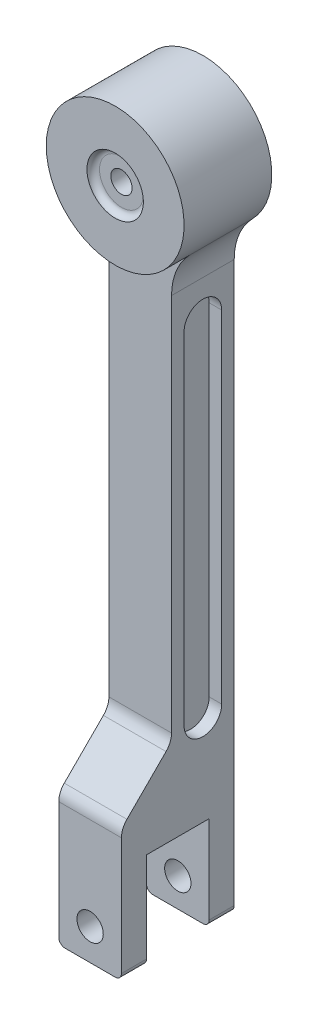
ISO-10303-21;
HEADER;
FILE_DESCRIPTION(('STEP AP214'),'2;1');
FILE_NAME('part.step','',(''),(''),'','','');
FILE_SCHEMA(('AUTOMOTIVE_DESIGN { 1 0 10303 214 1 1 1 1 }'));
ENDSEC;
DATA;
#1=APPLICATION_CONTEXT('core data for automotive mechanical design processes');
#2=APPLICATION_PROTOCOL_DEFINITION('international standard','automotive_design',2000,#1);
#3=PRODUCT_CONTEXT('',#1,'mechanical');
#4=PRODUCT('Part','Part','',(#3));
#5=PRODUCT_RELATED_PRODUCT_CATEGORY('part','',(#4));
#6=PRODUCT_DEFINITION_FORMATION('','',#4);
#7=PRODUCT_DEFINITION_CONTEXT('part definition',#1,'design');
#8=PRODUCT_DEFINITION('design','',#6,#7);
#9=PRODUCT_DEFINITION_SHAPE('','',#8);
#10=(LENGTH_UNIT() NAMED_UNIT(*) SI_UNIT(.MILLI.,.METRE.));
#11=(NAMED_UNIT(*) PLANE_ANGLE_UNIT() SI_UNIT($,.RADIAN.));
#12=(NAMED_UNIT(*) SI_UNIT($,.STERADIAN.) SOLID_ANGLE_UNIT());
#13=UNCERTAINTY_MEASURE_WITH_UNIT(LENGTH_MEASURE(1.E-05),#10,'distance_accuracy_value','');
#14=(GEOMETRIC_REPRESENTATION_CONTEXT(3) GLOBAL_UNCERTAINTY_ASSIGNED_CONTEXT((#13)) GLOBAL_UNIT_ASSIGNED_CONTEXT((#10,
#11,#12)) REPRESENTATION_CONTEXT('',''));
#15=CARTESIAN_POINT('',(0.,0.,0.));
#16=DIRECTION('',(0.,0.,1.));
#17=DIRECTION('',(1.,0.,0.));
#18=AXIS2_PLACEMENT_3D('',#15,#16,#17);
#19=CARTESIAN_POINT('',(-5.,105.001553241133,-33.));
#20=DIRECTION('',(0.,0.,1.));
#21=DIRECTION('',(-1.,0.,0.));
#22=AXIS2_PLACEMENT_3D('',#19,#20,#21);
#23=CYLINDRICAL_SURFACE('',#22,1.7);
#24=CARTESIAN_POINT('',(-5.,105.001553241133,-33.));
#25=DIRECTION('',(0.,0.,1.));
#26=DIRECTION('',(1.,0.,0.));
#27=AXIS2_PLACEMENT_3D('',#24,#25,#26);
#28=CIRCLE('',#27,1.7);
#29=CARTESIAN_POINT('',(-3.3,105.001553241133,-33.));
#30=VERTEX_POINT('',#29);
#31=EDGE_CURVE('E337',#30,#30,#28,.T.);
#32=ORIENTED_EDGE('',*,*,#31,.F.);
#33=EDGE_LOOP('',(#32));
#34=FACE_BOUND('',#33,.T.);
#35=CARTESIAN_POINT('',(-5.,105.001553241133,-25.));
#36=DIRECTION('',(0.,0.,-1.));
#37=DIRECTION('',(-1.,0.,0.));
#38=AXIS2_PLACEMENT_3D('',#35,#36,#37);
#39=CIRCLE('',#38,1.7);
#40=CARTESIAN_POINT('',(-6.7,105.001553241133,-25.));
#41=VERTEX_POINT('',#40);
#42=EDGE_CURVE('E252',#41,#41,#39,.T.);
#43=ORIENTED_EDGE('',*,*,#42,.F.);
#44=EDGE_LOOP('',(#43));
#45=FACE_BOUND('',#44,.T.);
#46=ADVANCED_FACE('F39',(#34,#45),#23,.F.);
#47=CARTESIAN_POINT('',(-10.,0.,-38.));
#48=DIRECTION('',(-1.,0.,0.));
#49=DIRECTION('',(0.,0.,-1.));
#50=AXIS2_PLACEMENT_3D('',#47,#48,#49);
#51=PLANE('',#50);
#52=DIRECTION('',(0.,1.,0.));
#53=VECTOR('',#52,1.);
#54=CARTESIAN_POINT('',(-10.,0.,-20.));
#55=LINE('',#54,#53);
#56=CARTESIAN_POINT('',(-10.,0.596931931651663,-20.));
#57=VERTEX_POINT('',#56);
#58=CARTESIAN_POINT('',(-10.,19.3542912445324,-20.));
#59=VERTEX_POINT('',#58);
#60=EDGE_CURVE('E313',#57,#59,#55,.T.);
#61=ORIENTED_EDGE('',*,*,#60,.T.);
#62=CARTESIAN_POINT('',(-10.,19.3542912445324,-23.));
#63=DIRECTION('',(1.,0.,0.));
#64=DIRECTION('',(0.,0.,-1.));
#65=AXIS2_PLACEMENT_3D('',#62,#63,#64);
#66=CIRCLE('',#65,3.);
#67=CARTESIAN_POINT('',(-10.,21.475611588092,-20.8786796564404));
#68=VERTEX_POINT('',#67);
#69=EDGE_CURVE('E400',#68,#59,#66,.T.);
#70=ORIENTED_EDGE('',*,*,#69,.F.);
#71=DIRECTION('',(0.,0.707106781186546,-0.707106781186549));
#72=VECTOR('',#71,1.);
#73=CARTESIAN_POINT('',(-10.,14.2984659658259,-13.7015340341742));
#74=LINE('',#73,#72);
#75=CARTESIAN_POINT('',(-10.,27.7182522752113,-27.1213203435596));
#76=VERTEX_POINT('',#75);
#77=EDGE_CURVE('E322',#68,#76,#74,.T.);
#78=ORIENTED_EDGE('',*,*,#77,.T.);
#79=CARTESIAN_POINT('',(-10.,29.8395726187709,-25.));
#80=DIRECTION('',(1.,0.,0.));
#81=DIRECTION('',(0.,0.,-1.));
#82=AXIS2_PLACEMENT_3D('',#79,#80,#81);
#83=CIRCLE('',#82,3.);
#84=CARTESIAN_POINT('',(-10.,29.8395726187709,-28.));
#85=VERTEX_POINT('',#84);
#86=EDGE_CURVE('E406',#85,#76,#83,.F.);
#87=ORIENTED_EDGE('',*,*,#86,.F.);
#88=DIRECTION('',(0.,1.,0.));
#89=VECTOR('',#88,1.);
#90=CARTESIAN_POINT('',(-10.,0.,-28.));
#91=LINE('',#90,#89);
#92=CARTESIAN_POINT('',(-10.,90.3046147844336,-28.));
#93=VERTEX_POINT('',#92);
#94=EDGE_CURVE('E347',#85,#93,#91,.T.);
#95=ORIENTED_EDGE('',*,*,#94,.T.);
#96=DIRECTION('',(0.,0.,1.));
#97=VECTOR('',#96,1.);
#98=CARTESIAN_POINT('',(-10.,90.3046147844336,-38.));
#99=LINE('',#98,#97);
#100=CARTESIAN_POINT('',(-10.,90.3046147844336,-38.));
#101=VERTEX_POINT('',#100);
#102=EDGE_CURVE('E366',#101,#93,#99,.T.);
#103=ORIENTED_EDGE('',*,*,#102,.F.);
#104=DIRECTION('',(0.,1.,0.));
#105=VECTOR('',#104,1.);
#106=CARTESIAN_POINT('',(-10.,0.,-38.));
#107=LINE('',#106,#105);
#108=CARTESIAN_POINT('',(-10.,0.999999999999999,-38.));
#109=VERTEX_POINT('',#108);
#110=EDGE_CURVE('E350',#109,#101,#107,.T.);
#111=ORIENTED_EDGE('',*,*,#110,.F.);
#112=DIRECTION('',(0.,0.,1.));
#113=VECTOR('',#112,1.);
#114=CARTESIAN_POINT('',(-10.,0.999999999999999,-38.));
#115=LINE('',#114,#113);
#116=CARTESIAN_POINT('',(-10.,0.999999999999999,-34.));
#117=VERTEX_POINT('',#116);
#118=EDGE_CURVE('E430',#117,#109,#115,.F.);
#119=ORIENTED_EDGE('',*,*,#118,.F.);
#120=DIRECTION('',(0.,-1.,0.));
#121=VECTOR('',#120,1.);
#122=CARTESIAN_POINT('',(-10.,0.,-34.));
#123=LINE('',#122,#121);
#124=CARTESIAN_POINT('',(-10.,18.,-34.));
#125=VERTEX_POINT('',#124);
#126=EDGE_CURVE('E301',#125,#117,#123,.T.);
#127=ORIENTED_EDGE('',*,*,#126,.F.);
#128=DIRECTION('',(0.,0.,-1.));
#129=VECTOR('',#128,1.);
#130=CARTESIAN_POINT('',(-10.,18.,-38.));
#131=LINE('',#130,#129);
#132=CARTESIAN_POINT('',(-10.,18.,-24.));
#133=VERTEX_POINT('',#132);
#134=EDGE_CURVE('E414',#133,#125,#131,.T.);
#135=ORIENTED_EDGE('',*,*,#134,.F.);
#136=DIRECTION('',(0.,1.,0.));
#137=VECTOR('',#136,1.);
#138=CARTESIAN_POINT('',(-10.,0.,-24.));
#139=LINE('',#138,#137);
#140=CARTESIAN_POINT('',(-10.,0.596931931651663,-24.));
#141=VERTEX_POINT('',#140);
#142=EDGE_CURVE('E304',#141,#133,#139,.T.);
#143=ORIENTED_EDGE('',*,*,#142,.F.);
#144=DIRECTION('',(0.,0.,1.));
#145=VECTOR('',#144,1.);
#146=CARTESIAN_POINT('',(-10.,0.596931931651663,-38.));
#147=LINE('',#146,#145);
#148=EDGE_CURVE('E433',#57,#141,#147,.F.);
#149=ORIENTED_EDGE('',*,*,#148,.F.);
#150=EDGE_LOOP('',(#61,#70,#78,#87,#95,#103,#111,#119,#127,#135,#143,#149));
#151=FACE_BOUND('',#150,.T.);
#152=DIRECTION('',(0.,1.,0.));
#153=VECTOR('',#152,1.);
#154=CARTESIAN_POINT('',(-10.,29.8395726187709,-30.));
#155=LINE('',#154,#153);
#156=CARTESIAN_POINT('',(-10.,29.8395726187709,-30.));
#157=VERTEX_POINT('',#156);
#158=CARTESIAN_POINT('',(-10.,84.3046147844336,-30.));
#159=VERTEX_POINT('',#158);
#160=EDGE_CURVE('E234',#157,#159,#155,.T.);
#161=ORIENTED_EDGE('',*,*,#160,.F.);
#162=CARTESIAN_POINT('',(-10.,29.8395726187709,-33.));
#163=DIRECTION('',(-1.,0.,0.));
#164=DIRECTION('',(0.,1.,0.));
#165=AXIS2_PLACEMENT_3D('',#162,#163,#164);
#166=CIRCLE('',#165,3.);
#167=CARTESIAN_POINT('',(-10.,29.8395726187709,-36.));
#168=VERTEX_POINT('',#167);
#169=EDGE_CURVE('E243',#168,#157,#166,.T.);
#170=ORIENTED_EDGE('',*,*,#169,.F.);
#171=DIRECTION('',(0.,-1.,0.));
#172=VECTOR('',#171,1.);
#173=CARTESIAN_POINT('',(-10.,29.8395726187709,-36.));
#174=LINE('',#173,#172);
#175=CARTESIAN_POINT('',(-10.,84.3046147844336,-36.));
#176=VERTEX_POINT('',#175);
#177=EDGE_CURVE('E240',#176,#168,#174,.T.);
#178=ORIENTED_EDGE('',*,*,#177,.F.);
#179=CARTESIAN_POINT('',(-10.,84.3046147844336,-33.));
#180=DIRECTION('',(-1.,0.,0.));
#181=DIRECTION('',(0.,-1.,0.));
#182=AXIS2_PLACEMENT_3D('',#179,#180,#181);
#183=CIRCLE('',#182,3.);
#184=EDGE_CURVE('E250',#159,#176,#183,.T.);
#185=ORIENTED_EDGE('',*,*,#184,.F.);
#186=EDGE_LOOP('',(#161,#170,#178,#185));
#187=FACE_BOUND('',#186,.T.);
#188=ADVANCED_FACE('F480',(#151,#187),#51,.T.);
#189=CARTESIAN_POINT('',(0.,0.,-38.));
#190=DIRECTION('',(-1.,0.,0.));
#191=DIRECTION('',(0.,-1.,0.));
#192=AXIS2_PLACEMENT_3D('',#189,#190,#191);
#193=PLANE('',#192);
#194=DIRECTION('',(0.,-1.,0.));
#195=VECTOR('',#194,1.);
#196=CARTESIAN_POINT('',(0.,29.8395726187709,-36.));
#197=LINE('',#196,#195);
#198=CARTESIAN_POINT('',(0.,84.3046147844336,-36.));
#199=VERTEX_POINT('',#198);
#200=CARTESIAN_POINT('',(0.,29.8395726187709,-36.));
#201=VERTEX_POINT('',#200);
#202=EDGE_CURVE('E271',#199,#201,#197,.T.);
#203=ORIENTED_EDGE('',*,*,#202,.T.);
#204=CARTESIAN_POINT('',(0.,29.8395726187709,-33.));
#205=DIRECTION('',(-1.,0.,0.));
#206=DIRECTION('',(0.,1.,0.));
#207=AXIS2_PLACEMENT_3D('',#204,#205,#206);
#208=CIRCLE('',#207,3.);
#209=CARTESIAN_POINT('',(0.,29.8395726187709,-30.));
#210=VERTEX_POINT('',#209);
#211=EDGE_CURVE('E274',#201,#210,#208,.T.);
#212=ORIENTED_EDGE('',*,*,#211,.T.);
#213=DIRECTION('',(0.,1.,0.));
#214=VECTOR('',#213,1.);
#215=CARTESIAN_POINT('',(0.,29.8395726187709,-30.));
#216=LINE('',#215,#214);
#217=CARTESIAN_POINT('',(0.,84.3046147844336,-30.));
#218=VERTEX_POINT('',#217);
#219=EDGE_CURVE('E264',#210,#218,#216,.T.);
#220=ORIENTED_EDGE('',*,*,#219,.T.);
#221=CARTESIAN_POINT('',(0.,84.3046147844336,-33.));
#222=DIRECTION('',(-1.,0.,0.));
#223=DIRECTION('',(0.,-1.,0.));
#224=AXIS2_PLACEMENT_3D('',#221,#222,#223);
#225=CIRCLE('',#224,3.);
#226=EDGE_CURVE('E257',#218,#199,#225,.T.);
#227=ORIENTED_EDGE('',*,*,#226,.T.);
#228=EDGE_LOOP('',(#203,#212,#220,#227));
#229=FACE_BOUND('',#228,.T.);
#230=DIRECTION('',(0.,1.,0.));
#231=VECTOR('',#230,1.);
#232=CARTESIAN_POINT('',(0.,0.,-24.));
#233=LINE('',#232,#231);
#234=CARTESIAN_POINT('',(0.,0.596931931651663,-24.));
#235=VERTEX_POINT('',#234);
#236=CARTESIAN_POINT('',(0.,15.,-24.));
#237=VERTEX_POINT('',#236);
#238=EDGE_CURVE('E305',#235,#237,#233,.T.);
#239=ORIENTED_EDGE('',*,*,#238,.T.);
#240=DIRECTION('',(0.,0.,1.));
#241=VECTOR('',#240,1.);
#242=CARTESIAN_POINT('',(0.,15.,-28.));
#243=LINE('',#242,#241);
#244=CARTESIAN_POINT('',(0.,15.,-34.));
#245=VERTEX_POINT('',#244);
#246=EDGE_CURVE('E310',#245,#237,#243,.T.);
#247=ORIENTED_EDGE('',*,*,#246,.F.);
#248=DIRECTION('',(0.,1.,0.));
#249=VECTOR('',#248,1.);
#250=CARTESIAN_POINT('',(0.,0.,-34.));
#251=LINE('',#250,#249);
#252=CARTESIAN_POINT('',(0.,1.,-34.));
#253=VERTEX_POINT('',#252);
#254=EDGE_CURVE('E296',#253,#245,#251,.T.);
#255=ORIENTED_EDGE('',*,*,#254,.F.);
#256=DIRECTION('',(0.,0.,1.));
#257=VECTOR('',#256,1.);
#258=CARTESIAN_POINT('',(0.,1.,-34.));
#259=LINE('',#258,#257);
#260=CARTESIAN_POINT('',(0.,1.,-38.));
#261=VERTEX_POINT('',#260);
#262=EDGE_CURVE('E441',#261,#253,#259,.T.);
#263=ORIENTED_EDGE('',*,*,#262,.F.);
#264=DIRECTION('',(0.,1.,0.));
#265=VECTOR('',#264,1.);
#266=CARTESIAN_POINT('',(0.,0.,-38.));
#267=LINE('',#266,#265);
#268=CARTESIAN_POINT('',(0.,90.3046147844336,-38.));
#269=VERTEX_POINT('',#268);
#270=EDGE_CURVE('E343',#261,#269,#267,.T.);
#271=ORIENTED_EDGE('',*,*,#270,.T.);
#272=DIRECTION('',(0.,0.,-1.));
#273=VECTOR('',#272,1.);
#274=CARTESIAN_POINT('',(0.,90.3046147844336,-38.));
#275=LINE('',#274,#273);
#276=CARTESIAN_POINT('',(0.,90.3046147844336,-28.));
#277=VERTEX_POINT('',#276);
#278=EDGE_CURVE('E374',#277,#269,#275,.T.);
#279=ORIENTED_EDGE('',*,*,#278,.F.);
#280=DIRECTION('',(0.,1.,0.));
#281=VECTOR('',#280,1.);
#282=CARTESIAN_POINT('',(0.,0.,-28.));
#283=LINE('',#282,#281);
#284=CARTESIAN_POINT('',(0.,29.8395726187709,-28.));
#285=VERTEX_POINT('',#284);
#286=EDGE_CURVE('E342',#285,#277,#283,.T.);
#287=ORIENTED_EDGE('',*,*,#286,.F.);
#288=CARTESIAN_POINT('',(0.,29.8395726187709,-25.));
#289=DIRECTION('',(1.,0.,0.));
#290=DIRECTION('',(0.,-1.,0.));
#291=AXIS2_PLACEMENT_3D('',#288,#289,#290);
#292=CIRCLE('',#291,3.);
#293=CARTESIAN_POINT('',(0.,27.7182522752113,-27.1213203435596));
#294=VERTEX_POINT('',#293);
#295=EDGE_CURVE('E403',#294,#285,#292,.T.);
#296=ORIENTED_EDGE('',*,*,#295,.F.);
#297=DIRECTION('',(0.,0.707106781186546,-0.707106781186549));
#298=VECTOR('',#297,1.);
#299=CARTESIAN_POINT('',(0.,14.2984659658259,-13.7015340341742));
#300=LINE('',#299,#298);
#301=CARTESIAN_POINT('',(0.,21.475611588092,-20.8786796564404));
#302=VERTEX_POINT('',#301);
#303=EDGE_CURVE('E314',#302,#294,#300,.T.);
#304=ORIENTED_EDGE('',*,*,#303,.F.);
#305=CARTESIAN_POINT('',(0.,19.3542912445324,-23.));
#306=DIRECTION('',(1.,0.,0.));
#307=DIRECTION('',(0.,-1.,0.));
#308=AXIS2_PLACEMENT_3D('',#305,#306,#307);
#309=CIRCLE('',#308,3.);
#310=CARTESIAN_POINT('',(0.,19.3542912445324,-20.));
#311=VERTEX_POINT('',#310);
#312=EDGE_CURVE('E397',#311,#302,#309,.F.);
#313=ORIENTED_EDGE('',*,*,#312,.F.);
#314=DIRECTION('',(0.,1.,0.));
#315=VECTOR('',#314,1.);
#316=CARTESIAN_POINT('',(0.,0.,-20.));
#317=LINE('',#316,#315);
#318=CARTESIAN_POINT('',(0.,0.596931931651663,-20.));
#319=VERTEX_POINT('',#318);
#320=EDGE_CURVE('E317',#319,#311,#317,.T.);
#321=ORIENTED_EDGE('',*,*,#320,.F.);
#322=DIRECTION('',(0.,0.,1.));
#323=VECTOR('',#322,1.);
#324=CARTESIAN_POINT('',(0.,0.596931931651663,-20.));
#325=LINE('',#324,#323);
#326=EDGE_CURVE('E444',#235,#319,#325,.T.);
#327=ORIENTED_EDGE('',*,*,#326,.F.);
#328=EDGE_LOOP('',(#239,#247,#255,#263,#271,#279,#287,#296,#304,#313,#321,#327));
#329=FACE_BOUND('',#328,.T.);
#330=ADVANCED_FACE('F486',(#229,#329),#193,.F.);
#331=CARTESIAN_POINT('',(0.,0.,-38.));
#332=DIRECTION('',(0.,-1.,0.));
#333=DIRECTION('',(1.,0.,0.));
#334=AXIS2_PLACEMENT_3D('',#331,#332,#333);
#335=PLANE('',#334);
#336=DIRECTION('',(-1.,0.,0.));
#337=VECTOR('',#336,1.);
#338=CARTESIAN_POINT('',(0.,0.,-38.));
#339=LINE('',#338,#337);
#340=CARTESIAN_POINT('',(-1.,0.,-38.));
#341=VERTEX_POINT('',#340);
#342=CARTESIAN_POINT('',(-9.,0.,-38.));
#343=VERTEX_POINT('',#342);
#344=EDGE_CURVE('E353',#341,#343,#339,.T.);
#345=ORIENTED_EDGE('',*,*,#344,.F.);
#346=DIRECTION('',(0.,0.,1.));
#347=VECTOR('',#346,1.);
#348=CARTESIAN_POINT('',(-1.,0.,-38.));
#349=LINE('',#348,#347);
#350=CARTESIAN_POINT('',(-1.,0.,-34.));
#351=VERTEX_POINT('',#350);
#352=EDGE_CURVE('E447',#351,#341,#349,.F.);
#353=ORIENTED_EDGE('',*,*,#352,.F.);
#354=DIRECTION('',(1.,0.,0.));
#355=VECTOR('',#354,1.);
#356=CARTESIAN_POINT('',(0.,0.,-34.));
#357=LINE('',#356,#355);
#358=CARTESIAN_POINT('',(-9.,0.,-34.));
#359=VERTEX_POINT('',#358);
#360=EDGE_CURVE('E386',#359,#351,#357,.T.);
#361=ORIENTED_EDGE('',*,*,#360,.F.);
#362=DIRECTION('',(0.,0.,1.));
#363=VECTOR('',#362,1.);
#364=CARTESIAN_POINT('',(-9.,0.,-38.));
#365=LINE('',#364,#363);
#366=EDGE_CURVE('E450',#343,#359,#365,.T.);
#367=ORIENTED_EDGE('',*,*,#366,.F.);
#368=EDGE_LOOP('',(#345,#353,#361,#367));
#369=FACE_BOUND('',#368,.T.);
#370=ADVANCED_FACE('F504',(#369),#335,.T.);
#371=CARTESIAN_POINT('',(0.,0.,-28.));
#372=DIRECTION('',(0.,0.,-1.));
#373=DIRECTION('',(1.,0.,0.));
#374=AXIS2_PLACEMENT_3D('',#371,#372,#373);
#375=PLANE('',#374);
#376=ORIENTED_EDGE('',*,*,#286,.T.);
#377=CARTESIAN_POINT('',(10.,90.3046147844336,-28.));
#378=DIRECTION('',(0.,0.,1.));
#379=DIRECTION('',(1.,0.,0.));
#380=AXIS2_PLACEMENT_3D('',#377,#378,#379);
#381=CIRCLE('',#380,10.);
#382=CARTESIAN_POINT('',(2.85714285714285,97.3031569066713,-28.));
#383=VERTEX_POINT('',#382);
#384=EDGE_CURVE('E382',#383,#277,#381,.T.);
#385=ORIENTED_EDGE('',*,*,#384,.F.);
#386=CARTESIAN_POINT('',(-5.,105.001553241133,-28.));
#387=DIRECTION('',(0.,0.,-1.));
#388=DIRECTION('',(-1.,0.,0.));
#389=AXIS2_PLACEMENT_3D('',#386,#387,#388);
#390=CIRCLE('',#389,11.);
#391=CARTESIAN_POINT('',(-12.8571428571429,97.3031569066713,-28.));
#392=VERTEX_POINT('',#391);
#393=EDGE_CURVE('E333',#383,#392,#390,.T.);
#394=ORIENTED_EDGE('',*,*,#393,.T.);
#395=CARTESIAN_POINT('',(-20.,90.3046147844336,-28.));
#396=DIRECTION('',(0.,0.,1.));
#397=DIRECTION('',(1.,0.,0.));
#398=AXIS2_PLACEMENT_3D('',#395,#396,#397);
#399=CIRCLE('',#398,10.);
#400=EDGE_CURVE('E377',#93,#392,#399,.T.);
#401=ORIENTED_EDGE('',*,*,#400,.F.);
#402=ORIENTED_EDGE('',*,*,#94,.F.);
#403=DIRECTION('',(1.,0.,0.));
#404=VECTOR('',#403,1.);
#405=CARTESIAN_POINT('',(0.,29.8395726187709,-28.));
#406=LINE('',#405,#404);
#407=EDGE_CURVE('E393',#285,#85,#406,.F.);
#408=ORIENTED_EDGE('',*,*,#407,.F.);
#409=EDGE_LOOP('',(#376,#385,#394,#401,#402,#408));
#410=FACE_BOUND('',#409,.T.);
#411=ADVANCED_FACE('F500',(#410),#375,.F.);
#412=CARTESIAN_POINT('',(-5.,105.001553241133,-38.));
#413=DIRECTION('',(0.,0.,1.));
#414=DIRECTION('',(-1.,0.,0.));
#415=AXIS2_PLACEMENT_3D('',#412,#413,#414);
#416=CYLINDRICAL_SURFACE('',#415,11.);
#417=ORIENTED_EDGE('',*,*,#393,.F.);
#418=DIRECTION('',(0.,0.,1.));
#419=VECTOR('',#418,1.);
#420=CARTESIAN_POINT('',(2.85714285714286,97.3031569066713,-38.));
#421=LINE('',#420,#419);
#422=CARTESIAN_POINT('',(2.85714285714286,97.3031569066713,-38.));
#423=VERTEX_POINT('',#422);
#424=EDGE_CURVE('E369',#423,#383,#421,.T.);
#425=ORIENTED_EDGE('',*,*,#424,.F.);
#426=CARTESIAN_POINT('',(-5.,105.001553241133,-38.));
#427=DIRECTION('',(0.,0.,1.));
#428=DIRECTION('',(1.,0.,0.));
#429=AXIS2_PLACEMENT_3D('',#426,#427,#428);
#430=CIRCLE('',#429,11.);
#431=CARTESIAN_POINT('',(-12.8571428571429,97.3031569066713,-38.));
#432=VERTEX_POINT('',#431);
#433=EDGE_CURVE('E346',#423,#432,#430,.T.);
#434=ORIENTED_EDGE('',*,*,#433,.T.);
#435=DIRECTION('',(0.,0.,1.));
#436=VECTOR('',#435,1.);
#437=CARTESIAN_POINT('',(-12.8571428571429,97.3031569066713,-38.));
#438=LINE('',#437,#436);
#439=EDGE_CURVE('E371',#392,#432,#438,.F.);
#440=ORIENTED_EDGE('',*,*,#439,.F.);
#441=EDGE_LOOP('',(#417,#425,#434,#440));
#442=FACE_BOUND('',#441,.T.);
#443=CARTESIAN_POINT('',(-5.,105.001553241133,-24.));
#444=DIRECTION('',(0.,0.,-1.));
#445=DIRECTION('',(-1.,0.,0.));
#446=AXIS2_PLACEMENT_3D('',#443,#444,#445);
#447=CIRCLE('',#446,11.);
#448=CARTESIAN_POINT('',(-16.,105.001553241133,-24.));
#449=VERTEX_POINT('',#448);
#450=EDGE_CURVE('E334',#449,#449,#447,.T.);
#451=ORIENTED_EDGE('',*,*,#450,.T.);
#452=EDGE_LOOP('',(#451));
#453=FACE_BOUND('',#452,.T.);
#454=ADVANCED_FACE('F503',(#442,#453),#416,.T.);
#455=CARTESIAN_POINT('',(-5.,105.001553241133,-38.));
#456=DIRECTION('',(0.,0.,1.));
#457=DIRECTION('',(-1.,0.,0.));
#458=AXIS2_PLACEMENT_3D('',#455,#456,#457);
#459=CYLINDRICAL_SURFACE('',#458,8.);
#460=CARTESIAN_POINT('',(-5.,105.001553241133,-33.));
#461=DIRECTION('',(0.,0.,1.));
#462=DIRECTION('',(1.,0.,0.));
#463=AXIS2_PLACEMENT_3D('',#460,#461,#462);
#464=CIRCLE('',#463,8.);
#465=CARTESIAN_POINT('',(3.,105.001553241133,-33.));
#466=VERTEX_POINT('',#465);
#467=EDGE_CURVE('E359',#466,#466,#464,.T.);
#468=ORIENTED_EDGE('',*,*,#467,.T.);
#469=EDGE_LOOP('',(#468));
#470=FACE_BOUND('',#469,.T.);
#471=CARTESIAN_POINT('',(-5.,105.001553241133,-38.));
#472=DIRECTION('',(0.,0.,1.));
#473=DIRECTION('',(1.,0.,0.));
#474=AXIS2_PLACEMENT_3D('',#471,#472,#473);
#475=CIRCLE('',#474,8.);
#476=CARTESIAN_POINT('',(3.,105.001553241133,-38.));
#477=VERTEX_POINT('',#476);
#478=EDGE_CURVE('E356',#477,#477,#475,.T.);
#479=ORIENTED_EDGE('',*,*,#478,.F.);
#480=EDGE_LOOP('',(#479));
#481=FACE_BOUND('',#480,.T.);
#482=ADVANCED_FACE('F498',(#470,#481),#459,.F.);
#483=CARTESIAN_POINT('',(0.,0.,-38.));
#484=DIRECTION('',(0.,0.,-1.));
#485=DIRECTION('',(1.,0.,0.));
#486=AXIS2_PLACEMENT_3D('',#483,#484,#485);
#487=PLANE('',#486);
#488=CARTESIAN_POINT('',(-5.,4.59693193165166,-38.));
#489=DIRECTION('',(0.,0.,1.));
#490=DIRECTION('',(1.,0.,0.));
#491=AXIS2_PLACEMENT_3D('',#488,#489,#490);
#492=CIRCLE('',#491,2.1);
#493=CARTESIAN_POINT('',(-2.9,4.59693193165166,-38.));
#494=VERTEX_POINT('',#493);
#495=EDGE_CURVE('E281',#494,#494,#492,.T.);
#496=ORIENTED_EDGE('',*,*,#495,.T.);
#497=EDGE_LOOP('',(#496));
#498=FACE_BOUND('',#497,.T.);
#499=ORIENTED_EDGE('',*,*,#110,.T.);
#500=CARTESIAN_POINT('',(-20.,90.3046147844336,-38.));
#501=DIRECTION('',(0.,0.,1.));
#502=DIRECTION('',(1.,0.,0.));
#503=AXIS2_PLACEMENT_3D('',#500,#501,#502);
#504=CIRCLE('',#503,10.);
#505=EDGE_CURVE('E380',#432,#101,#504,.F.);
#506=ORIENTED_EDGE('',*,*,#505,.F.);
#507=ORIENTED_EDGE('',*,*,#433,.F.);
#508=CARTESIAN_POINT('',(10.,90.3046147844336,-38.));
#509=DIRECTION('',(0.,0.,1.));
#510=DIRECTION('',(1.,0.,0.));
#511=AXIS2_PLACEMENT_3D('',#508,#509,#510);
#512=CIRCLE('',#511,10.);
#513=EDGE_CURVE('E384',#269,#423,#512,.F.);
#514=ORIENTED_EDGE('',*,*,#513,.F.);
#515=ORIENTED_EDGE('',*,*,#270,.F.);
#516=CARTESIAN_POINT('',(-1.,1.,-38.));
#517=DIRECTION('',(0.,0.,1.));
#518=DIRECTION('',(1.,0.,0.));
#519=AXIS2_PLACEMENT_3D('',#516,#517,#518);
#520=CIRCLE('',#519,1.);
#521=EDGE_CURVE('E457',#341,#261,#520,.T.);
#522=ORIENTED_EDGE('',*,*,#521,.F.);
#523=ORIENTED_EDGE('',*,*,#344,.T.);
#524=CARTESIAN_POINT('',(-9.,0.999999999999999,-38.));
#525=DIRECTION('',(0.,0.,1.));
#526=DIRECTION('',(1.,0.,0.));
#527=AXIS2_PLACEMENT_3D('',#524,#525,#526);
#528=CIRCLE('',#527,1.);
#529=EDGE_CURVE('E47',#109,#343,#528,.T.);
#530=ORIENTED_EDGE('',*,*,#529,.F.);
#531=EDGE_LOOP('',(#499,#506,#507,#514,#515,#522,#523,#530));
#532=FACE_BOUND('',#531,.T.);
#533=ORIENTED_EDGE('',*,*,#478,.T.);
#534=EDGE_LOOP('',(#533));
#535=FACE_BOUND('',#534,.T.);
#536=ADVANCED_FACE('F495',(#498,#532,#535),#487,.T.);
#537=CARTESIAN_POINT('',(0.,0.,-33.));
#538=DIRECTION('',(0.,0.,-1.));
#539=DIRECTION('',(1.,0.,0.));
#540=AXIS2_PLACEMENT_3D('',#537,#538,#539);
#541=PLANE('',#540);
#542=ORIENTED_EDGE('',*,*,#31,.T.);
#543=EDGE_LOOP('',(#542));
#544=FACE_BOUND('',#543,.T.);
#545=ORIENTED_EDGE('',*,*,#467,.F.);
#546=EDGE_LOOP('',(#545));
#547=FACE_BOUND('',#546,.T.);
#548=ADVANCED_FACE('F493',(#544,#547),#541,.T.);
#549=CARTESIAN_POINT('',(-5.,105.001553241133,-24.));
#550=DIRECTION('',(0.,0.,1.));
#551=DIRECTION('',(-1.,0.,0.));
#552=AXIS2_PLACEMENT_3D('',#549,#550,#551);
#553=PLANE('',#552);
#554=CARTESIAN_POINT('',(-5.,105.001553241133,-24.));
#555=DIRECTION('',(0.,0.,-1.));
#556=DIRECTION('',(-1.,0.,0.));
#557=AXIS2_PLACEMENT_3D('',#554,#555,#556);
#558=CIRCLE('',#557,4.5);
#559=CARTESIAN_POINT('',(-9.5,105.001553241133,-24.));
#560=VERTEX_POINT('',#559);
#561=EDGE_CURVE('E246',#560,#560,#558,.T.);
#562=ORIENTED_EDGE('',*,*,#561,.T.);
#563=EDGE_LOOP('',(#562));
#564=FACE_BOUND('',#563,.T.);
#565=ORIENTED_EDGE('',*,*,#450,.F.);
#566=EDGE_LOOP('',(#565));
#567=FACE_BOUND('',#566,.T.);
#568=ADVANCED_FACE('F465',(#564,#567),#553,.T.);
#569=CARTESIAN_POINT('',(-20.,90.3046147844336,-38.));
#570=DIRECTION('',(0.,0.,1.));
#571=DIRECTION('',(-1.,0.,0.));
#572=AXIS2_PLACEMENT_3D('',#569,#570,#571);
#573=CYLINDRICAL_SURFACE('',#572,10.);
#574=ORIENTED_EDGE('',*,*,#505,.T.);
#575=ORIENTED_EDGE('',*,*,#102,.T.);
#576=ORIENTED_EDGE('',*,*,#400,.T.);
#577=ORIENTED_EDGE('',*,*,#439,.T.);
#578=EDGE_LOOP('',(#574,#575,#576,#577));
#579=FACE_BOUND('',#578,.T.);
#580=ADVANCED_FACE('F518',(#579),#573,.F.);
#581=CARTESIAN_POINT('',(10.,90.3046147844336,-38.));
#582=DIRECTION('',(0.,0.,1.));
#583=DIRECTION('',(-1.,0.,0.));
#584=AXIS2_PLACEMENT_3D('',#581,#582,#583);
#585=CYLINDRICAL_SURFACE('',#584,10.);
#586=ORIENTED_EDGE('',*,*,#513,.T.);
#587=ORIENTED_EDGE('',*,*,#424,.T.);
#588=ORIENTED_EDGE('',*,*,#384,.T.);
#589=ORIENTED_EDGE('',*,*,#278,.T.);
#590=EDGE_LOOP('',(#586,#587,#588,#589));
#591=FACE_BOUND('',#590,.T.);
#592=ADVANCED_FACE('F521',(#591),#585,.F.);
#593=CARTESIAN_POINT('',(-40.0832179129826,0.,-20.));
#594=DIRECTION('',(0.,0.,1.));
#595=DIRECTION('',(-1.,0.,0.));
#596=AXIS2_PLACEMENT_3D('',#593,#594,#595);
#597=PLANE('',#596);
#598=CARTESIAN_POINT('',(-5.,4.59693193165166,-20.));
#599=DIRECTION('',(0.,0.,1.));
#600=DIRECTION('',(1.,0.,0.));
#601=AXIS2_PLACEMENT_3D('',#598,#599,#600);
#602=CIRCLE('',#601,2.1);
#603=CARTESIAN_POINT('',(-2.9,4.59693193165166,-20.));
#604=VERTEX_POINT('',#603);
#605=EDGE_CURVE('E287',#604,#604,#602,.T.);
#606=ORIENTED_EDGE('',*,*,#605,.F.);
#607=EDGE_LOOP('',(#606));
#608=FACE_BOUND('',#607,.T.);
#609=DIRECTION('',(1.,0.,0.));
#610=VECTOR('',#609,1.);
#611=CARTESIAN_POINT('',(-40.0832179129826,-0.403068068348337,-20.));
#612=LINE('',#611,#610);
#613=CARTESIAN_POINT('',(-9.,-0.403068068348337,-20.));
#614=VERTEX_POINT('',#613);
#615=CARTESIAN_POINT('',(-1.,-0.403068068348337,-20.));
#616=VERTEX_POINT('',#615);
#617=EDGE_CURVE('E308',#614,#616,#612,.T.);
#618=ORIENTED_EDGE('',*,*,#617,.T.);
#619=CARTESIAN_POINT('',(-1.,0.596931931651663,-20.));
#620=DIRECTION('',(0.,0.,-1.));
#621=DIRECTION('',(-1.,0.,0.));
#622=AXIS2_PLACEMENT_3D('',#619,#620,#621);
#623=CIRCLE('',#622,1.);
#624=EDGE_CURVE('E425',#319,#616,#623,.T.);
#625=ORIENTED_EDGE('',*,*,#624,.F.);
#626=ORIENTED_EDGE('',*,*,#320,.T.);
#627=DIRECTION('',(1.,0.,0.));
#628=VECTOR('',#627,1.);
#629=CARTESIAN_POINT('',(-40.0832179129826,19.3542912445324,-20.));
#630=LINE('',#629,#628);
#631=EDGE_CURVE('E395',#59,#311,#630,.T.);
#632=ORIENTED_EDGE('',*,*,#631,.F.);
#633=ORIENTED_EDGE('',*,*,#60,.F.);
#634=CARTESIAN_POINT('',(-9.,0.596931931651663,-20.));
#635=DIRECTION('',(0.,0.,-1.));
#636=DIRECTION('',(-1.,0.,0.));
#637=AXIS2_PLACEMENT_3D('',#634,#635,#636);
#638=CIRCLE('',#637,1.);
#639=EDGE_CURVE('E428',#614,#57,#638,.T.);
#640=ORIENTED_EDGE('',*,*,#639,.F.);
#641=EDGE_LOOP('',(#618,#625,#626,#632,#633,#640));
#642=FACE_BOUND('',#641,.T.);
#643=ADVANCED_FACE('F525',(#608,#642),#597,.T.);
#644=CARTESIAN_POINT('',(-40.0832179129826,14.2984659658259,-13.7015340341742));
#645=DIRECTION('',(0.,0.707106781186549,0.707106781186546));
#646=DIRECTION('',(0.,0.707106781186546,-0.707106781186549));
#647=AXIS2_PLACEMENT_3D('',#644,#645,#646);
#648=PLANE('',#647);
#649=ORIENTED_EDGE('',*,*,#77,.F.);
#650=DIRECTION('',(1.,0.,0.));
#651=VECTOR('',#650,1.);
#652=CARTESIAN_POINT('',(-40.0832179129826,21.475611588092,-20.8786796564404));
#653=LINE('',#652,#651);
#654=EDGE_CURVE('E389',#302,#68,#653,.F.);
#655=ORIENTED_EDGE('',*,*,#654,.F.);
#656=ORIENTED_EDGE('',*,*,#303,.T.);
#657=DIRECTION('',(1.,0.,0.));
#658=VECTOR('',#657,1.);
#659=CARTESIAN_POINT('',(-40.0832179129826,27.7182522752113,-27.1213203435596));
#660=LINE('',#659,#658);
#661=EDGE_CURVE('E391',#76,#294,#660,.T.);
#662=ORIENTED_EDGE('',*,*,#661,.F.);
#663=EDGE_LOOP('',(#649,#655,#656,#662));
#664=FACE_BOUND('',#663,.T.);
#665=ADVANCED_FACE('F593',(#664),#648,.T.);
#666=CARTESIAN_POINT('',(-40.0832179129826,15.,-28.));
#667=DIRECTION('',(0.,-1.,0.));
#668=DIRECTION('',(0.,0.,1.));
#669=AXIS2_PLACEMENT_3D('',#666,#667,#668);
#670=PLANE('',#669);
#671=DIRECTION('',(1.,0.,0.));
#672=VECTOR('',#671,1.);
#673=CARTESIAN_POINT('',(-16.,15.,-34.));
#674=LINE('',#673,#672);
#675=CARTESIAN_POINT('',(-7.00000000000001,15.,-34.));
#676=VERTEX_POINT('',#675);
#677=EDGE_CURVE('E299',#676,#245,#674,.T.);
#678=ORIENTED_EDGE('',*,*,#677,.T.);
#679=ORIENTED_EDGE('',*,*,#246,.T.);
#680=DIRECTION('',(1.,0.,0.));
#681=VECTOR('',#680,1.);
#682=CARTESIAN_POINT('',(-40.0832179129826,15.,-24.));
#683=LINE('',#682,#681);
#684=CARTESIAN_POINT('',(-7.00000000000001,15.,-24.));
#685=VERTEX_POINT('',#684);
#686=EDGE_CURVE('E327',#685,#237,#683,.T.);
#687=ORIENTED_EDGE('',*,*,#686,.F.);
#688=DIRECTION('',(0.,0.,1.));
#689=VECTOR('',#688,1.);
#690=CARTESIAN_POINT('',(-7.00000000000001,15.,-28.));
#691=LINE('',#690,#689);
#692=EDGE_CURVE('E409',#676,#685,#691,.T.);
#693=ORIENTED_EDGE('',*,*,#692,.F.);
#694=EDGE_LOOP('',(#678,#679,#687,#693));
#695=FACE_BOUND('',#694,.T.);
#696=ADVANCED_FACE('F610',(#695),#670,.T.);
#697=CARTESIAN_POINT('',(-40.0832179129826,0.,-24.));
#698=DIRECTION('',(0.,0.,1.));
#699=DIRECTION('',(-1.,0.,0.));
#700=AXIS2_PLACEMENT_3D('',#697,#698,#699);
#701=PLANE('',#700);
#702=CARTESIAN_POINT('',(-5.,4.59693193165166,-24.));
#703=DIRECTION('',(0.,0.,-1.));
#704=DIRECTION('',(-1.,0.,0.));
#705=AXIS2_PLACEMENT_3D('',#702,#703,#704);
#706=CIRCLE('',#705,2.1);
#707=CARTESIAN_POINT('',(-7.1,4.59693193165166,-24.));
#708=VERTEX_POINT('',#707);
#709=EDGE_CURVE('E293',#708,#708,#706,.T.);
#710=ORIENTED_EDGE('',*,*,#709,.F.);
#711=EDGE_LOOP('',(#710));
#712=FACE_BOUND('',#711,.T.);
#713=ORIENTED_EDGE('',*,*,#142,.T.);
#714=DIRECTION('',(0.707106781186546,-0.707106781186549,0.));
#715=VECTOR('',#714,1.);
#716=CARTESIAN_POINT('',(-16.0416089564912,24.0416089564913,-24.));
#717=LINE('',#716,#715);
#718=EDGE_CURVE('E417',#685,#133,#717,.F.);
#719=ORIENTED_EDGE('',*,*,#718,.F.);
#720=ORIENTED_EDGE('',*,*,#686,.T.);
#721=ORIENTED_EDGE('',*,*,#238,.F.);
#722=CARTESIAN_POINT('',(-1.,0.596931931651663,-24.));
#723=DIRECTION('',(0.,0.,-1.));
#724=DIRECTION('',(-1.,0.,0.));
#725=AXIS2_PLACEMENT_3D('',#722,#723,#724);
#726=CIRCLE('',#725,1.);
#727=CARTESIAN_POINT('',(-1.,-0.403068068348337,-24.));
#728=VERTEX_POINT('',#727);
#729=EDGE_CURVE('E436',#728,#235,#726,.F.);
#730=ORIENTED_EDGE('',*,*,#729,.F.);
#731=DIRECTION('',(1.,0.,0.));
#732=VECTOR('',#731,1.);
#733=CARTESIAN_POINT('',(-40.0832179129826,-0.403068068348337,-24.));
#734=LINE('',#733,#732);
#735=CARTESIAN_POINT('',(-9.,-0.403068068348337,-24.));
#736=VERTEX_POINT('',#735);
#737=EDGE_CURVE('E309',#736,#728,#734,.T.);
#738=ORIENTED_EDGE('',*,*,#737,.F.);
#739=CARTESIAN_POINT('',(-9.,0.596931931651663,-24.));
#740=DIRECTION('',(0.,0.,-1.));
#741=DIRECTION('',(-1.,0.,0.));
#742=AXIS2_PLACEMENT_3D('',#739,#740,#741);
#743=CIRCLE('',#742,1.);
#744=EDGE_CURVE('E438',#141,#736,#743,.F.);
#745=ORIENTED_EDGE('',*,*,#744,.F.);
#746=EDGE_LOOP('',(#713,#719,#720,#721,#730,#738,#745));
#747=FACE_BOUND('',#746,.T.);
#748=ADVANCED_FACE('F605',(#712,#747),#701,.F.);
#749=CARTESIAN_POINT('',(-40.0832179129826,-0.403068068348337,-28.));
#750=DIRECTION('',(0.,-1.,0.));
#751=DIRECTION('',(0.,0.,1.));
#752=AXIS2_PLACEMENT_3D('',#749,#750,#751);
#753=PLANE('',#752);
#754=ORIENTED_EDGE('',*,*,#737,.T.);
#755=DIRECTION('',(0.,0.,1.));
#756=VECTOR('',#755,1.);
#757=CARTESIAN_POINT('',(-1.,-0.403068068348337,-24.));
#758=LINE('',#757,#756);
#759=EDGE_CURVE('E421',#616,#728,#758,.F.);
#760=ORIENTED_EDGE('',*,*,#759,.F.);
#761=ORIENTED_EDGE('',*,*,#617,.F.);
#762=DIRECTION('',(0.,0.,1.));
#763=VECTOR('',#762,1.);
#764=CARTESIAN_POINT('',(-9.,-0.403068068348337,-28.));
#765=LINE('',#764,#763);
#766=EDGE_CURVE('E423',#736,#614,#765,.T.);
#767=ORIENTED_EDGE('',*,*,#766,.F.);
#768=EDGE_LOOP('',(#754,#760,#761,#767));
#769=FACE_BOUND('',#768,.T.);
#770=ADVANCED_FACE('F615',(#769),#753,.T.);
#771=CARTESIAN_POINT('',(-16.,0.,-34.));
#772=DIRECTION('',(0.,0.,1.));
#773=DIRECTION('',(-1.,0.,0.));
#774=AXIS2_PLACEMENT_3D('',#771,#772,#773);
#775=PLANE('',#774);
#776=CARTESIAN_POINT('',(-5.,4.59693193165166,-34.));
#777=DIRECTION('',(0.,0.,-1.));
#778=DIRECTION('',(-1.,0.,0.));
#779=AXIS2_PLACEMENT_3D('',#776,#777,#778);
#780=CIRCLE('',#779,2.1);
#781=CARTESIAN_POINT('',(-7.1,4.59693193165166,-34.));
#782=VERTEX_POINT('',#781);
#783=EDGE_CURVE('E290',#782,#782,#780,.T.);
#784=ORIENTED_EDGE('',*,*,#783,.T.);
#785=EDGE_LOOP('',(#784));
#786=FACE_BOUND('',#785,.T.);
#787=ORIENTED_EDGE('',*,*,#360,.T.);
#788=CARTESIAN_POINT('',(-1.,1.,-34.));
#789=DIRECTION('',(0.,0.,-1.));
#790=DIRECTION('',(-1.,0.,0.));
#791=AXIS2_PLACEMENT_3D('',#788,#789,#790);
#792=CIRCLE('',#791,1.);
#793=EDGE_CURVE('E453',#253,#351,#792,.T.);
#794=ORIENTED_EDGE('',*,*,#793,.F.);
#795=ORIENTED_EDGE('',*,*,#254,.T.);
#796=ORIENTED_EDGE('',*,*,#677,.F.);
#797=DIRECTION('',(-0.707106781186546,0.707106781186549,0.));
#798=VECTOR('',#797,1.);
#799=CARTESIAN_POINT('',(-7.00000000000001,15.,-34.));
#800=LINE('',#799,#798);
#801=EDGE_CURVE('E419',#125,#676,#800,.F.);
#802=ORIENTED_EDGE('',*,*,#801,.F.);
#803=ORIENTED_EDGE('',*,*,#126,.T.);
#804=CARTESIAN_POINT('',(-9.,0.999999999999999,-34.));
#805=DIRECTION('',(0.,0.,-1.));
#806=DIRECTION('',(-1.,0.,0.));
#807=AXIS2_PLACEMENT_3D('',#804,#805,#806);
#808=CIRCLE('',#807,1.);
#809=EDGE_CURVE('E455',#359,#117,#808,.T.);
#810=ORIENTED_EDGE('',*,*,#809,.F.);
#811=EDGE_LOOP('',(#787,#794,#795,#796,#802,#803,#810));
#812=FACE_BOUND('',#811,.T.);
#813=ADVANCED_FACE('F531',(#786,#812),#775,.T.);
#814=CARTESIAN_POINT('',(-40.0832179129826,29.8395726187709,-25.));
#815=DIRECTION('',(1.,0.,0.));
#816=DIRECTION('',(0.,0.,1.));
#817=AXIS2_PLACEMENT_3D('',#814,#815,#816);
#818=CYLINDRICAL_SURFACE('',#817,3.);
#819=ORIENTED_EDGE('',*,*,#86,.T.);
#820=ORIENTED_EDGE('',*,*,#661,.T.);
#821=ORIENTED_EDGE('',*,*,#295,.T.);
#822=ORIENTED_EDGE('',*,*,#407,.T.);
#823=EDGE_LOOP('',(#819,#820,#821,#822));
#824=FACE_BOUND('',#823,.T.);
#825=ADVANCED_FACE('F527',(#824),#818,.F.);
#826=CARTESIAN_POINT('',(-40.0832179129826,19.3542912445324,-23.));
#827=DIRECTION('',(1.,0.,0.));
#828=DIRECTION('',(0.,0.,1.));
#829=AXIS2_PLACEMENT_3D('',#826,#827,#828);
#830=CYLINDRICAL_SURFACE('',#829,3.);
#831=ORIENTED_EDGE('',*,*,#69,.T.);
#832=ORIENTED_EDGE('',*,*,#631,.T.);
#833=ORIENTED_EDGE('',*,*,#312,.T.);
#834=ORIENTED_EDGE('',*,*,#654,.T.);
#835=EDGE_LOOP('',(#831,#832,#833,#834));
#836=FACE_BOUND('',#835,.T.);
#837=ADVANCED_FACE('F530',(#836),#830,.T.);
#838=CARTESIAN_POINT('',(-5.,4.59693193165166,-20.));
#839=DIRECTION('',(0.,0.,-1.));
#840=DIRECTION('',(1.,0.,0.));
#841=AXIS2_PLACEMENT_3D('',#838,#839,#840);
#842=CYLINDRICAL_SURFACE('',#841,2.1);
#843=ORIENTED_EDGE('',*,*,#783,.F.);
#844=EDGE_LOOP('',(#843));
#845=FACE_BOUND('',#844,.T.);
#846=ORIENTED_EDGE('',*,*,#495,.F.);
#847=EDGE_LOOP('',(#846));
#848=FACE_BOUND('',#847,.T.);
#849=ADVANCED_FACE('F535',(#845,#848),#842,.F.);
#850=ORIENTED_EDGE('',*,*,#605,.T.);
#851=EDGE_LOOP('',(#850));
#852=FACE_BOUND('',#851,.T.);
#853=ORIENTED_EDGE('',*,*,#709,.T.);
#854=EDGE_LOOP('',(#853));
#855=FACE_BOUND('',#854,.T.);
#856=ADVANCED_FACE('F541',(#852,#855),#842,.F.);
#857=CARTESIAN_POINT('',(-7.00000000000001,15.,-28.));
#858=DIRECTION('',(0.707106781186549,0.707106781186546,0.));
#859=DIRECTION('',(0.,0.,1.));
#860=AXIS2_PLACEMENT_3D('',#857,#858,#859);
#861=PLANE('',#860);
#862=ORIENTED_EDGE('',*,*,#801,.T.);
#863=ORIENTED_EDGE('',*,*,#692,.T.);
#864=ORIENTED_EDGE('',*,*,#718,.T.);
#865=ORIENTED_EDGE('',*,*,#134,.T.);
#866=EDGE_LOOP('',(#862,#863,#864,#865));
#867=FACE_BOUND('',#866,.T.);
#868=ADVANCED_FACE('F537',(#867),#861,.F.);
#869=CARTESIAN_POINT('',(-9.,0.596931931651663,-28.));
#870=DIRECTION('',(0.,0.,1.));
#871=DIRECTION('',(-1.,0.,0.));
#872=AXIS2_PLACEMENT_3D('',#869,#870,#871);
#873=CYLINDRICAL_SURFACE('',#872,1.);
#874=ORIENTED_EDGE('',*,*,#744,.T.);
#875=ORIENTED_EDGE('',*,*,#766,.T.);
#876=ORIENTED_EDGE('',*,*,#639,.T.);
#877=ORIENTED_EDGE('',*,*,#148,.T.);
#878=EDGE_LOOP('',(#874,#875,#876,#877));
#879=FACE_BOUND('',#878,.T.);
#880=ADVANCED_FACE('F540',(#879),#873,.T.);
#881=CARTESIAN_POINT('',(-1.,0.596931931651663,-38.));
#882=DIRECTION('',(0.,0.,-1.));
#883=DIRECTION('',(1.,0.,0.));
#884=AXIS2_PLACEMENT_3D('',#881,#882,#883);
#885=CYLINDRICAL_SURFACE('',#884,1.);
#886=ORIENTED_EDGE('',*,*,#729,.T.);
#887=ORIENTED_EDGE('',*,*,#326,.T.);
#888=ORIENTED_EDGE('',*,*,#624,.T.);
#889=ORIENTED_EDGE('',*,*,#759,.T.);
#890=EDGE_LOOP('',(#886,#887,#888,#889));
#891=FACE_BOUND('',#890,.T.);
#892=ADVANCED_FACE('F545',(#891),#885,.T.);
#893=CARTESIAN_POINT('',(-9.,0.999999999999999,-38.));
#894=DIRECTION('',(0.,0.,1.));
#895=DIRECTION('',(-1.,0.,0.));
#896=AXIS2_PLACEMENT_3D('',#893,#894,#895);
#897=CYLINDRICAL_SURFACE('',#896,1.);
#898=ORIENTED_EDGE('',*,*,#529,.T.);
#899=ORIENTED_EDGE('',*,*,#366,.T.);
#900=ORIENTED_EDGE('',*,*,#809,.T.);
#901=ORIENTED_EDGE('',*,*,#118,.T.);
#902=EDGE_LOOP('',(#898,#899,#900,#901));
#903=FACE_BOUND('',#902,.T.);
#904=ADVANCED_FACE('F549',(#903),#897,.T.);
#905=CARTESIAN_POINT('',(-1.,1.,-38.));
#906=DIRECTION('',(0.,0.,-1.));
#907=DIRECTION('',(1.,0.,0.));
#908=AXIS2_PLACEMENT_3D('',#905,#906,#907);
#909=CYLINDRICAL_SURFACE('',#908,1.);
#910=ORIENTED_EDGE('',*,*,#521,.T.);
#911=ORIENTED_EDGE('',*,*,#262,.T.);
#912=ORIENTED_EDGE('',*,*,#793,.T.);
#913=ORIENTED_EDGE('',*,*,#352,.T.);
#914=EDGE_LOOP('',(#910,#911,#912,#913));
#915=FACE_BOUND('',#914,.T.);
#916=ADVANCED_FACE('F552',(#915),#909,.T.);
#917=CARTESIAN_POINT('',(-2.,84.3046147844336,-33.));
#918=DIRECTION('',(1.,0.,0.));
#919=DIRECTION('',(0.,1.,0.));
#920=AXIS2_PLACEMENT_3D('',#917,#918,#919);
#921=CYLINDRICAL_SURFACE('',#920,3.);
#922=ORIENTED_EDGE('',*,*,#226,.F.);
#923=DIRECTION('',(1.,0.,0.));
#924=VECTOR('',#923,1.);
#925=CARTESIAN_POINT('',(-2.,84.3046147844336,-30.));
#926=LINE('',#925,#924);
#927=CARTESIAN_POINT('',(-2.,84.3046147844336,-30.));
#928=VERTEX_POINT('',#927);
#929=EDGE_CURVE('E279',#928,#218,#926,.T.);
#930=ORIENTED_EDGE('',*,*,#929,.F.);
#931=CARTESIAN_POINT('',(-2.,84.3046147844336,-33.));
#932=DIRECTION('',(-1.,0.,0.));
#933=DIRECTION('',(0.,-1.,0.));
#934=AXIS2_PLACEMENT_3D('',#931,#932,#933);
#935=CIRCLE('',#934,3.);
#936=CARTESIAN_POINT('',(-2.,84.3046147844336,-36.));
#937=VERTEX_POINT('',#936);
#938=EDGE_CURVE('E261',#928,#937,#935,.T.);
#939=ORIENTED_EDGE('',*,*,#938,.T.);
#940=DIRECTION('',(1.,0.,0.));
#941=VECTOR('',#940,1.);
#942=CARTESIAN_POINT('',(-2.,84.3046147844336,-36.));
#943=LINE('',#942,#941);
#944=EDGE_CURVE('E62',#937,#199,#943,.T.);
#945=ORIENTED_EDGE('',*,*,#944,.T.);
#946=EDGE_LOOP('',(#922,#930,#939,#945));
#947=FACE_BOUND('',#946,.T.);
#948=ADVANCED_FACE('F555',(#947),#921,.F.);
#949=CARTESIAN_POINT('',(-2.,29.8395726187709,-30.));
#950=DIRECTION('',(0.,0.,1.));
#951=DIRECTION('',(-1.,0.,0.));
#952=AXIS2_PLACEMENT_3D('',#949,#950,#951);
#953=PLANE('',#952);
#954=ORIENTED_EDGE('',*,*,#219,.F.);
#955=DIRECTION('',(1.,0.,0.));
#956=VECTOR('',#955,1.);
#957=CARTESIAN_POINT('',(-2.,29.8395726187709,-30.));
#958=LINE('',#957,#956);
#959=CARTESIAN_POINT('',(-2.,29.8395726187709,-30.));
#960=VERTEX_POINT('',#959);
#961=EDGE_CURVE('E282',#960,#210,#958,.T.);
#962=ORIENTED_EDGE('',*,*,#961,.F.);
#963=DIRECTION('',(0.,1.,0.));
#964=VECTOR('',#963,1.);
#965=CARTESIAN_POINT('',(-2.,29.8395726187709,-30.));
#966=LINE('',#965,#964);
#967=EDGE_CURVE('E268',#960,#928,#966,.T.);
#968=ORIENTED_EDGE('',*,*,#967,.T.);
#969=ORIENTED_EDGE('',*,*,#929,.T.);
#970=EDGE_LOOP('',(#954,#962,#968,#969));
#971=FACE_BOUND('',#970,.T.);
#972=ADVANCED_FACE('F560',(#971),#953,.F.);
#973=CARTESIAN_POINT('',(-2.,29.8395726187709,-33.));
#974=DIRECTION('',(1.,0.,0.));
#975=DIRECTION('',(0.,1.,0.));
#976=AXIS2_PLACEMENT_3D('',#973,#974,#975);
#977=CYLINDRICAL_SURFACE('',#976,3.);
#978=ORIENTED_EDGE('',*,*,#211,.F.);
#979=DIRECTION('',(1.,0.,0.));
#980=VECTOR('',#979,1.);
#981=CARTESIAN_POINT('',(-2.,29.8395726187709,-36.));
#982=LINE('',#981,#980);
#983=CARTESIAN_POINT('',(-2.,29.8395726187709,-36.));
#984=VERTEX_POINT('',#983);
#985=EDGE_CURVE('E284',#984,#201,#982,.T.);
#986=ORIENTED_EDGE('',*,*,#985,.F.);
#987=CARTESIAN_POINT('',(-2.,29.8395726187709,-33.));
#988=DIRECTION('',(-1.,0.,0.));
#989=DIRECTION('',(0.,1.,0.));
#990=AXIS2_PLACEMENT_3D('',#987,#988,#989);
#991=CIRCLE('',#990,3.);
#992=EDGE_CURVE('E266',#984,#960,#991,.T.);
#993=ORIENTED_EDGE('',*,*,#992,.T.);
#994=ORIENTED_EDGE('',*,*,#961,.T.);
#995=EDGE_LOOP('',(#978,#986,#993,#994));
#996=FACE_BOUND('',#995,.T.);
#997=ADVANCED_FACE('F827',(#996),#977,.F.);
#998=CARTESIAN_POINT('',(-2.,29.8395726187709,-36.));
#999=DIRECTION('',(0.,0.,-1.));
#1000=DIRECTION('',(0.,-1.,0.));
#1001=AXIS2_PLACEMENT_3D('',#998,#999,#1000);
#1002=PLANE('',#1001);
#1003=ORIENTED_EDGE('',*,*,#202,.F.);
#1004=ORIENTED_EDGE('',*,*,#944,.F.);
#1005=DIRECTION('',(0.,-1.,0.));
#1006=VECTOR('',#1005,1.);
#1007=CARTESIAN_POINT('',(-2.,29.8395726187709,-36.));
#1008=LINE('',#1007,#1006);
#1009=EDGE_CURVE('E263',#937,#984,#1008,.T.);
#1010=ORIENTED_EDGE('',*,*,#1009,.T.);
#1011=ORIENTED_EDGE('',*,*,#985,.T.);
#1012=EDGE_LOOP('',(#1003,#1004,#1010,#1011));
#1013=FACE_BOUND('',#1012,.T.);
#1014=ADVANCED_FACE('F836',(#1013),#1002,.F.);
#1015=CARTESIAN_POINT('',(-2.,84.3046147844336,-33.));
#1016=DIRECTION('',(-1.,0.,0.));
#1017=DIRECTION('',(0.,-1.,0.));
#1018=AXIS2_PLACEMENT_3D('',#1015,#1016,#1017);
#1019=PLANE('',#1018);
#1020=ORIENTED_EDGE('',*,*,#938,.F.);
#1021=ORIENTED_EDGE('',*,*,#967,.F.);
#1022=ORIENTED_EDGE('',*,*,#992,.F.);
#1023=ORIENTED_EDGE('',*,*,#1009,.F.);
#1024=EDGE_LOOP('',(#1020,#1021,#1022,#1023));
#1025=FACE_BOUND('',#1024,.T.);
#1026=ADVANCED_FACE('F845',(#1025),#1019,.F.);
#1027=CARTESIAN_POINT('',(-8.,84.3046147844336,-33.));
#1028=DIRECTION('',(-1.,0.,0.));
#1029=DIRECTION('',(0.,0.,-1.));
#1030=AXIS2_PLACEMENT_3D('',#1027,#1028,#1029);
#1031=CYLINDRICAL_SURFACE('',#1030,3.);
#1032=ORIENTED_EDGE('',*,*,#184,.T.);
#1033=DIRECTION('',(-1.,0.,0.));
#1034=VECTOR('',#1033,1.);
#1035=CARTESIAN_POINT('',(-8.,84.3046147844336,-36.));
#1036=LINE('',#1035,#1034);
#1037=CARTESIAN_POINT('',(-8.,84.3046147844336,-36.));
#1038=VERTEX_POINT('',#1037);
#1039=EDGE_CURVE('E239',#1038,#176,#1036,.T.);
#1040=ORIENTED_EDGE('',*,*,#1039,.F.);
#1041=CARTESIAN_POINT('',(-8.,84.3046147844336,-33.));
#1042=DIRECTION('',(-1.,0.,0.));
#1043=DIRECTION('',(0.,-1.,0.));
#1044=AXIS2_PLACEMENT_3D('',#1041,#1042,#1043);
#1045=CIRCLE('',#1044,3.);
#1046=CARTESIAN_POINT('',(-8.,84.3046147844336,-30.));
#1047=VERTEX_POINT('',#1046);
#1048=EDGE_CURVE('E225',#1047,#1038,#1045,.T.);
#1049=ORIENTED_EDGE('',*,*,#1048,.F.);
#1050=DIRECTION('',(-1.,0.,0.));
#1051=VECTOR('',#1050,1.);
#1052=CARTESIAN_POINT('',(-8.,84.3046147844336,-30.));
#1053=LINE('',#1052,#1051);
#1054=EDGE_CURVE('E54',#1047,#159,#1053,.T.);
#1055=ORIENTED_EDGE('',*,*,#1054,.T.);
#1056=EDGE_LOOP('',(#1032,#1040,#1049,#1055));
#1057=FACE_BOUND('',#1056,.T.);
#1058=ADVANCED_FACE('F238',(#1057),#1031,.F.);
#1059=CARTESIAN_POINT('',(-8.,29.8395726187709,-36.));
#1060=DIRECTION('',(0.,0.,1.));
#1061=DIRECTION('',(0.,1.,0.));
#1062=AXIS2_PLACEMENT_3D('',#1059,#1060,#1061);
#1063=PLANE('',#1062);
#1064=ORIENTED_EDGE('',*,*,#177,.T.);
#1065=DIRECTION('',(-1.,0.,0.));
#1066=VECTOR('',#1065,1.);
#1067=CARTESIAN_POINT('',(-8.,29.8395726187709,-36.));
#1068=LINE('',#1067,#1066);
#1069=CARTESIAN_POINT('',(-8.,29.8395726187709,-36.));
#1070=VERTEX_POINT('',#1069);
#1071=EDGE_CURVE('E258',#1070,#168,#1068,.T.);
#1072=ORIENTED_EDGE('',*,*,#1071,.F.);
#1073=DIRECTION('',(0.,-1.,0.));
#1074=VECTOR('',#1073,1.);
#1075=CARTESIAN_POINT('',(-8.,29.8395726187709,-36.));
#1076=LINE('',#1075,#1074);
#1077=EDGE_CURVE('E236',#1038,#1070,#1076,.T.);
#1078=ORIENTED_EDGE('',*,*,#1077,.F.);
#1079=ORIENTED_EDGE('',*,*,#1039,.T.);
#1080=EDGE_LOOP('',(#1064,#1072,#1078,#1079));
#1081=FACE_BOUND('',#1080,.T.);
#1082=ADVANCED_FACE('F862',(#1081),#1063,.T.);
#1083=CARTESIAN_POINT('',(-8.,29.8395726187709,-33.));
#1084=DIRECTION('',(-1.,0.,0.));
#1085=DIRECTION('',(0.,0.,-1.));
#1086=AXIS2_PLACEMENT_3D('',#1083,#1084,#1085);
#1087=CYLINDRICAL_SURFACE('',#1086,3.);
#1088=ORIENTED_EDGE('',*,*,#169,.T.);
#1089=DIRECTION('',(-1.,0.,0.));
#1090=VECTOR('',#1089,1.);
#1091=CARTESIAN_POINT('',(-8.,29.8395726187709,-30.));
#1092=LINE('',#1091,#1090);
#1093=CARTESIAN_POINT('',(-8.,29.8395726187709,-30.));
#1094=VERTEX_POINT('',#1093);
#1095=EDGE_CURVE('E235',#1094,#157,#1092,.T.);
#1096=ORIENTED_EDGE('',*,*,#1095,.F.);
#1097=CARTESIAN_POINT('',(-8.,29.8395726187709,-33.));
#1098=DIRECTION('',(-1.,0.,0.));
#1099=DIRECTION('',(0.,1.,0.));
#1100=AXIS2_PLACEMENT_3D('',#1097,#1098,#1099);
#1101=CIRCLE('',#1100,3.);
#1102=EDGE_CURVE('E227',#1070,#1094,#1101,.T.);
#1103=ORIENTED_EDGE('',*,*,#1102,.F.);
#1104=ORIENTED_EDGE('',*,*,#1071,.T.);
#1105=EDGE_LOOP('',(#1088,#1096,#1103,#1104));
#1106=FACE_BOUND('',#1105,.T.);
#1107=ADVANCED_FACE('F870',(#1106),#1087,.F.);
#1108=CARTESIAN_POINT('',(-8.,29.8395726187709,-30.));
#1109=DIRECTION('',(0.,0.,-1.));
#1110=DIRECTION('',(1.,0.,0.));
#1111=AXIS2_PLACEMENT_3D('',#1108,#1109,#1110);
#1112=PLANE('',#1111);
#1113=ORIENTED_EDGE('',*,*,#160,.T.);
#1114=ORIENTED_EDGE('',*,*,#1054,.F.);
#1115=DIRECTION('',(0.,1.,0.));
#1116=VECTOR('',#1115,1.);
#1117=CARTESIAN_POINT('',(-8.,29.8395726187709,-30.));
#1118=LINE('',#1117,#1116);
#1119=EDGE_CURVE('E222',#1094,#1047,#1118,.T.);
#1120=ORIENTED_EDGE('',*,*,#1119,.F.);
#1121=ORIENTED_EDGE('',*,*,#1095,.T.);
#1122=EDGE_LOOP('',(#1113,#1114,#1120,#1121));
#1123=FACE_BOUND('',#1122,.T.);
#1124=ADVANCED_FACE('F232',(#1123),#1112,.T.);
#1125=CARTESIAN_POINT('',(-8.,84.3046147844336,-33.));
#1126=DIRECTION('',(1.,0.,0.));
#1127=DIRECTION('',(0.,-1.,0.));
#1128=AXIS2_PLACEMENT_3D('',#1125,#1126,#1127);
#1129=PLANE('',#1128);
#1130=ORIENTED_EDGE('',*,*,#1048,.T.);
#1131=ORIENTED_EDGE('',*,*,#1077,.T.);
#1132=ORIENTED_EDGE('',*,*,#1102,.T.);
#1133=ORIENTED_EDGE('',*,*,#1119,.T.);
#1134=EDGE_LOOP('',(#1130,#1131,#1132,#1133));
#1135=FACE_BOUND('',#1134,.T.);
#1136=ADVANCED_FACE('F223',(#1135),#1129,.F.);
#1137=CARTESIAN_POINT('',(-5.,105.001553241133,-25.));
#1138=DIRECTION('',(0.,0.,1.));
#1139=DIRECTION('',(-1.,0.,0.));
#1140=AXIS2_PLACEMENT_3D('',#1137,#1138,#1139);
#1141=PLANE('',#1140);
#1142=CARTESIAN_POINT('',(-5.,105.001553241133,-25.));
#1143=DIRECTION('',(0.,0.,-1.));
#1144=DIRECTION('',(-1.,0.,0.));
#1145=AXIS2_PLACEMENT_3D('',#1142,#1143,#1144);
#1146=CIRCLE('',#1145,3.5);
#1147=CARTESIAN_POINT('',(-8.5,105.001553241133,-25.));
#1148=VERTEX_POINT('',#1147);
#1149=EDGE_CURVE('E11',#1148,#1148,#1146,.T.);
#1150=ORIENTED_EDGE('',*,*,#1149,.F.);
#1151=EDGE_LOOP('',(#1150));
#1152=FACE_BOUND('',#1151,.T.);
#1153=ORIENTED_EDGE('',*,*,#42,.T.);
#1154=EDGE_LOOP('',(#1153));
#1155=FACE_BOUND('',#1154,.T.);
#1156=ADVANCED_FACE('F470',(#1152,#1155),#1141,.T.);
#1157=CARTESIAN_POINT('',(-5.,105.001553241133,-24.));
#1158=DIRECTION('',(0.,0.,1.));
#1159=DIRECTION('',(-1.,0.,0.));
#1160=AXIS2_PLACEMENT_3D('',#1157,#1158,#1159);
#1161=TOROIDAL_SURFACE('',#1160,3.5,1.);
#1162=ORIENTED_EDGE('',*,*,#561,.F.);
#1163=EDGE_LOOP('',(#1162));
#1164=FACE_BOUND('',#1163,.T.);
#1165=ORIENTED_EDGE('',*,*,#1149,.T.);
#1166=EDGE_LOOP('',(#1165));
#1167=FACE_BOUND('',#1166,.T.);
#1168=ADVANCED_FACE('F41',(#1164,#1167),#1161,.F.);
#1169=CLOSED_SHELL('',(#46,#188,#330,#370,#411,#454,#482,#536,#548,#568,#580,#592,#643,#665,
#696,#748,#770,#813,#825,#837,#849,#856,#868,#880,#892,#904,#916,#948,#972,#997,#1014,#1026,
#1058,#1082,#1107,#1124,#1136,#1156,#1168));
#1170=MANIFOLD_SOLID_BREP('B2',#1169);
#1171=ADVANCED_BREP_SHAPE_REPRESENTATION('',(#18,#1170),#14);
#1172=SHAPE_DEFINITION_REPRESENTATION(#9,#1171);
ENDSEC;
END-ISO-10303-21;
